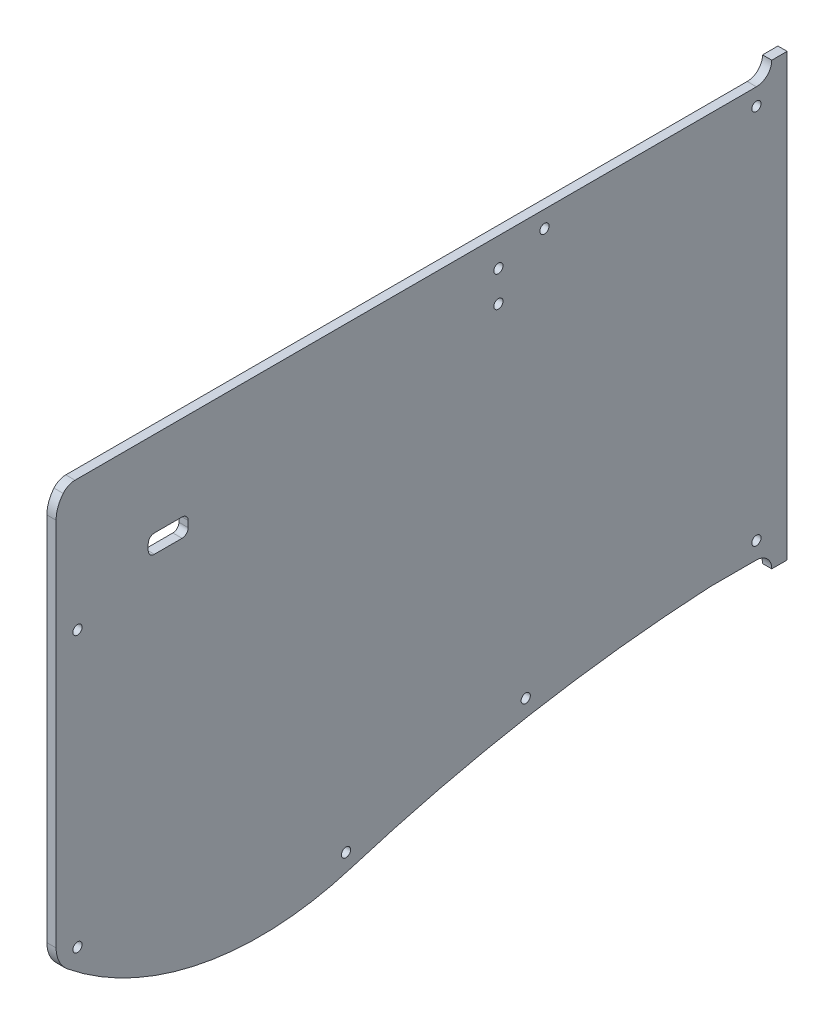
ISO-10303-21;
HEADER;
FILE_DESCRIPTION(('STEP AP214'),'2;1');
FILE_NAME('part.step','',(''),(''),'','','');
FILE_SCHEMA(('AUTOMOTIVE_DESIGN { 1 0 10303 214 1 1 1 1 }'));
ENDSEC;
DATA;
#1=APPLICATION_CONTEXT('core data for automotive mechanical design processes');
#2=APPLICATION_PROTOCOL_DEFINITION('international standard','automotive_design',2000,#1);
#3=PRODUCT_CONTEXT('',#1,'mechanical');
#4=PRODUCT('Part','Part','',(#3));
#5=PRODUCT_RELATED_PRODUCT_CATEGORY('part','',(#4));
#6=PRODUCT_DEFINITION_FORMATION('','',#4);
#7=PRODUCT_DEFINITION_CONTEXT('part definition',#1,'design');
#8=PRODUCT_DEFINITION('design','',#6,#7);
#9=PRODUCT_DEFINITION_SHAPE('','',#8);
#10=(LENGTH_UNIT() NAMED_UNIT(*) SI_UNIT(.MILLI.,.METRE.));
#11=(NAMED_UNIT(*) PLANE_ANGLE_UNIT() SI_UNIT($,.RADIAN.));
#12=(NAMED_UNIT(*) SI_UNIT($,.STERADIAN.) SOLID_ANGLE_UNIT());
#13=UNCERTAINTY_MEASURE_WITH_UNIT(LENGTH_MEASURE(1.E-05),#10,'distance_accuracy_value','');
#14=(GEOMETRIC_REPRESENTATION_CONTEXT(3) GLOBAL_UNCERTAINTY_ASSIGNED_CONTEXT((#13)) GLOBAL_UNIT_ASSIGNED_CONTEXT((#10,
#11,#12)) REPRESENTATION_CONTEXT('',''));
#15=CARTESIAN_POINT('',(0.,0.,0.));
#16=DIRECTION('',(0.,0.,1.));
#17=DIRECTION('',(1.,0.,0.));
#18=AXIS2_PLACEMENT_3D('',#15,#16,#17);
#19=CARTESIAN_POINT('',(-67.35,0.,0.));
#20=DIRECTION('',(1.,0.,0.));
#21=DIRECTION('',(0.,1.,0.));
#22=AXIS2_PLACEMENT_3D('',#19,#20,#21);
#23=PLANE('',#22);
#24=CARTESIAN_POINT('',(-67.35,32.6100000000027,-3.96799742352916));
#25=DIRECTION('',(-1.,0.,0.));
#26=DIRECTION('',(0.,-1.,0.));
#27=AXIS2_PLACEMENT_3D('',#24,#25,#26);
#28=CIRCLE('',#27,1.5);
#29=CARTESIAN_POINT('',(-67.35,31.1100000000027,-3.96799742352916));
#30=VERTEX_POINT('',#29);
#31=EDGE_CURVE('E678',#30,#30,#28,.T.);
#32=ORIENTED_EDGE('',*,*,#31,.T.);
#33=EDGE_LOOP('',(#32));
#34=FACE_BOUND('',#33,.T.);
#35=CARTESIAN_POINT('',(-67.35,-56.8674528394987,-3.96799742352917));
#36=DIRECTION('',(-1.,0.,0.));
#37=DIRECTION('',(0.,-1.,0.));
#38=AXIS2_PLACEMENT_3D('',#35,#36,#37);
#39=CIRCLE('',#38,1.5);
#40=CARTESIAN_POINT('',(-67.35,-58.3674528394987,-3.96799742352917));
#41=VERTEX_POINT('',#40);
#42=EDGE_CURVE('E684',#41,#41,#39,.T.);
#43=ORIENTED_EDGE('',*,*,#42,.T.);
#44=EDGE_LOOP('',(#43));
#45=FACE_BOUND('',#44,.T.);
#46=CARTESIAN_POINT('',(-67.35,-73.8406357420001,-91.3872993332656));
#47=DIRECTION('',(-1.,0.,0.));
#48=DIRECTION('',(0.,-1.,0.));
#49=AXIS2_PLACEMENT_3D('',#46,#47,#48);
#50=CIRCLE('',#49,1.5);
#51=CARTESIAN_POINT('',(-67.35,-75.3406357420001,-91.3872993332656));
#52=VERTEX_POINT('',#51);
#53=EDGE_CURVE('E690',#52,#52,#50,.T.);
#54=ORIENTED_EDGE('',*,*,#53,.T.);
#55=EDGE_LOOP('',(#54));
#56=FACE_BOUND('',#55,.T.);
#57=CARTESIAN_POINT('',(-67.35,-59.6455333368173,-149.8967439074));
#58=DIRECTION('',(-1.,0.,0.));
#59=DIRECTION('',(0.,-1.,0.));
#60=AXIS2_PLACEMENT_3D('',#57,#58,#59);
#61=CIRCLE('',#60,1.5);
#62=CARTESIAN_POINT('',(-67.35,-61.1455333368173,-149.8967439074));
#63=VERTEX_POINT('',#62);
#64=EDGE_CURVE('E696',#63,#63,#61,.T.);
#65=ORIENTED_EDGE('',*,*,#64,.T.);
#66=EDGE_LOOP('',(#65));
#67=FACE_BOUND('',#66,.T.);
#68=CARTESIAN_POINT('',(-67.35,-52.7209830876955,-225.));
#69=DIRECTION('',(-1.,0.,0.));
#70=DIRECTION('',(0.,-1.,0.));
#71=AXIS2_PLACEMENT_3D('',#68,#69,#70);
#72=CIRCLE('',#71,1.5);
#73=CARTESIAN_POINT('',(-67.35,-54.2209830876955,-225.));
#74=VERTEX_POINT('',#73);
#75=EDGE_CURVE('E702',#74,#74,#72,.T.);
#76=ORIENTED_EDGE('',*,*,#75,.T.);
#77=EDGE_LOOP('',(#76));
#78=FACE_BOUND('',#77,.T.);
#79=CARTESIAN_POINT('',(-67.35,69.7,-156.));
#80=DIRECTION('',(-1.,0.,0.));
#81=DIRECTION('',(0.,-1.,0.));
#82=AXIS2_PLACEMENT_3D('',#79,#80,#81);
#83=CIRCLE('',#82,1.5);
#84=CARTESIAN_POINT('',(-67.35,68.2,-156.));
#85=VERTEX_POINT('',#84);
#86=EDGE_CURVE('E708',#85,#85,#83,.T.);
#87=ORIENTED_EDGE('',*,*,#86,.T.);
#88=EDGE_LOOP('',(#87));
#89=FACE_BOUND('',#88,.T.);
#90=CARTESIAN_POINT('',(-67.35,69.7,-225.));
#91=DIRECTION('',(-1.,0.,0.));
#92=DIRECTION('',(0.,-1.,0.));
#93=AXIS2_PLACEMENT_3D('',#90,#91,#92);
#94=CIRCLE('',#93,1.5);
#95=CARTESIAN_POINT('',(-67.35,68.2,-225.));
#96=VERTEX_POINT('',#95);
#97=EDGE_CURVE('E214',#96,#96,#94,.T.);
#98=ORIENTED_EDGE('',*,*,#97,.T.);
#99=EDGE_LOOP('',(#98));
#100=FACE_BOUND('',#99,.T.);
#101=DIRECTION('',(0.,1.,0.));
#102=VECTOR('',#101,1.);
#103=CARTESIAN_POINT('',(-67.35,72.2,-235.));
#104=LINE('',#103,#102);
#105=CARTESIAN_POINT('',(-67.35,-63.225295910599,-235.));
#106=VERTEX_POINT('',#105);
#107=CARTESIAN_POINT('',(-67.35,80.2,-235.));
#108=VERTEX_POINT('',#107);
#109=EDGE_CURVE('E241',#106,#108,#104,.T.);
#110=ORIENTED_EDGE('',*,*,#109,.T.);
#111=DIRECTION('',(0.,0.,-1.));
#112=VECTOR('',#111,1.);
#113=CARTESIAN_POINT('',(-67.35,80.2,-230.));
#114=LINE('',#113,#112);
#115=CARTESIAN_POINT('',(-67.35,80.2,-230.));
#116=VERTEX_POINT('',#115);
#117=EDGE_CURVE('E212',#116,#108,#114,.T.);
#118=ORIENTED_EDGE('',*,*,#117,.F.);
#119=CARTESIAN_POINT('',(-67.35,80.2,-225.));
#120=DIRECTION('',(1.,0.,0.));
#121=DIRECTION('',(0.,1.,0.));
#122=AXIS2_PLACEMENT_3D('',#119,#120,#121);
#123=CIRCLE('',#122,5.);
#124=CARTESIAN_POINT('',(-67.35,75.2,-225.));
#125=VERTEX_POINT('',#124);
#126=EDGE_CURVE('E191',#116,#125,#123,.F.);
#127=ORIENTED_EDGE('',*,*,#126,.T.);
#128=DIRECTION('',(0.,0.,1.));
#129=VECTOR('',#128,1.);
#130=CARTESIAN_POINT('',(-67.35,75.2,3.));
#131=LINE('',#130,#129);
#132=CARTESIAN_POINT('',(-67.35,75.2,-3.1581254575403));
#133=VERTEX_POINT('',#132);
#134=EDGE_CURVE('E201',#125,#133,#131,.T.);
#135=ORIENTED_EDGE('',*,*,#134,.T.);
#136=CARTESIAN_POINT('',(-67.35,70.2,-3.1581254575403));
#137=DIRECTION('',(1.,0.,0.));
#138=DIRECTION('',(0.,1.,0.));
#139=AXIS2_PLACEMENT_3D('',#136,#137,#138);
#140=CIRCLE('',#139,5.);
#141=CARTESIAN_POINT('',(-67.35,73.4,0.683749084919405));
#142=VERTEX_POINT('',#141);
#143=EDGE_CURVE('E267',#142,#133,#140,.F.);
#144=ORIENTED_EDGE('',*,*,#143,.F.);
#145=CARTESIAN_POINT('',(-67.35,67.,-7.));
#146=DIRECTION('',(1.,0.,0.));
#147=DIRECTION('',(0.,1.,0.));
#148=AXIS2_PLACEMENT_3D('',#145,#146,#147);
#149=CIRCLE('',#148,10.);
#150=CARTESIAN_POINT('',(-67.35,67.,3.));
#151=VERTEX_POINT('',#150);
#152=EDGE_CURVE('E269',#151,#142,#149,.F.);
#153=ORIENTED_EDGE('',*,*,#152,.F.);
#154=DIRECTION('',(0.,-1.,0.));
#155=VECTOR('',#154,1.);
#156=CARTESIAN_POINT('',(-67.35,0.,3.));
#157=LINE('',#156,#155);
#158=CARTESIAN_POINT('',(-67.35,-53.596869973958,3.));
#159=VERTEX_POINT('',#158);
#160=EDGE_CURVE('E207',#151,#159,#157,.T.);
#161=ORIENTED_EDGE('',*,*,#160,.T.);
#162=CARTESIAN_POINT('',(-67.35,-53.596869973958,-7.));
#163=DIRECTION('',(1.,0.,0.));
#164=DIRECTION('',(0.,1.,0.));
#165=AXIS2_PLACEMENT_3D('',#162,#163,#164);
#166=CIRCLE('',#165,10.);
#167=CARTESIAN_POINT('',(-67.35,-61.3801825213862,-0.721461492588713));
#168=VERTEX_POINT('',#167);
#169=EDGE_CURVE('E272',#168,#159,#166,.F.);
#170=ORIENTED_EDGE('',*,*,#169,.F.);
#171=CARTESIAN_POINT('',(-67.35,16.452942952896,-63.5068465667016));
#172=DIRECTION('',(1.,0.,0.));
#173=DIRECTION('',(0.,1.,0.));
#174=AXIS2_PLACEMENT_3D('',#171,#172,#173);
#175=CIRCLE('',#174,100.);
#176=CARTESIAN_POINT('',(-67.35,-79.0958175708036,-93.0099711874042));
#177=VERTEX_POINT('',#176);
#178=EDGE_CURVE('E274',#177,#168,#175,.F.);
#179=ORIENTED_EDGE('',*,*,#178,.F.);
#180=CARTESIAN_POINT('',(-67.3500000000001,-542.024846852173,-235.951153957029));
#181=DIRECTION('',(1.,0.,0.));
#182=DIRECTION('',(0.,1.,0.));
#183=AXIS2_PLACEMENT_3D('',#180,#181,#182);
#184=CIRCLE('',#183,484.495064869571);
#185=CARTESIAN_POINT('',(-67.35,-58.225295910599,-210.));
#186=VERTEX_POINT('',#185);
#187=EDGE_CURVE('E213',#177,#186,#184,.F.);
#188=ORIENTED_EDGE('',*,*,#187,.T.);
#189=DIRECTION('',(0.,0.,-1.));
#190=VECTOR('',#189,1.);
#191=CARTESIAN_POINT('',(-67.35,-58.225295910599,-225.));
#192=LINE('',#191,#190);
#193=CARTESIAN_POINT('',(-67.35,-58.225295910599,-225.));
#194=VERTEX_POINT('',#193);
#195=EDGE_CURVE('E206',#186,#194,#192,.T.);
#196=ORIENTED_EDGE('',*,*,#195,.T.);
#197=CARTESIAN_POINT('',(-67.35,-63.225295910599,-225.));
#198=DIRECTION('',(1.,0.,0.));
#199=DIRECTION('',(0.,1.,0.));
#200=AXIS2_PLACEMENT_3D('',#197,#198,#199);
#201=CIRCLE('',#200,5.);
#202=CARTESIAN_POINT('',(-67.35,-63.225295910599,-230.));
#203=VERTEX_POINT('',#202);
#204=EDGE_CURVE('E277',#194,#203,#201,.F.);
#205=ORIENTED_EDGE('',*,*,#204,.T.);
#206=DIRECTION('',(0.,0.,1.));
#207=VECTOR('',#206,1.);
#208=CARTESIAN_POINT('',(-67.35,-63.225295910599,-230.));
#209=LINE('',#208,#207);
#210=EDGE_CURVE('E264',#106,#203,#209,.T.);
#211=ORIENTED_EDGE('',*,*,#210,.F.);
#212=EDGE_LOOP('',(#110,#118,#127,#135,#144,#153,#161,#170,#179,#188,#196,#205,#211));
#213=FACE_BOUND('',#212,.T.);
#214=CARTESIAN_POINT('',(-67.35,56.,-141.));
#215=DIRECTION('',(-1.,0.,0.));
#216=DIRECTION('',(0.,-1.,0.));
#217=AXIS2_PLACEMENT_3D('',#214,#215,#216);
#218=CIRCLE('',#217,1.5);
#219=CARTESIAN_POINT('',(-67.35,54.5,-141.));
#220=VERTEX_POINT('',#219);
#221=EDGE_CURVE('E252',#220,#220,#218,.T.);
#222=ORIENTED_EDGE('',*,*,#221,.T.);
#223=EDGE_LOOP('',(#222));
#224=FACE_BOUND('',#223,.T.);
#225=CARTESIAN_POINT('',(-67.35,66.,-141.));
#226=DIRECTION('',(-1.,0.,0.));
#227=DIRECTION('',(0.,-1.,0.));
#228=AXIS2_PLACEMENT_3D('',#225,#226,#227);
#229=CIRCLE('',#228,1.5);
#230=CARTESIAN_POINT('',(-67.35,64.5,-141.));
#231=VERTEX_POINT('',#230);
#232=EDGE_CURVE('E255',#231,#231,#229,.T.);
#233=ORIENTED_EDGE('',*,*,#232,.T.);
#234=EDGE_LOOP('',(#233));
#235=FACE_BOUND('',#234,.T.);
#236=DIRECTION('',(0.,0.,1.));
#237=VECTOR('',#236,1.);
#238=CARTESIAN_POINT('',(-67.35,41.4,-358.498117719212));
#239=LINE('',#238,#237);
#240=CARTESIAN_POINT('',(-67.35,41.4,-38.));
#241=VERTEX_POINT('',#240);
#242=CARTESIAN_POINT('',(-67.35,41.4,-29.));
#243=VERTEX_POINT('',#242);
#244=EDGE_CURVE('E645',#241,#243,#239,.T.);
#245=ORIENTED_EDGE('',*,*,#244,.T.);
#246=CARTESIAN_POINT('',(-67.35,43.4,-29.));
#247=DIRECTION('',(-1.,0.,0.));
#248=DIRECTION('',(0.,-1.,0.));
#249=AXIS2_PLACEMENT_3D('',#246,#247,#248);
#250=CIRCLE('',#249,2.);
#251=CARTESIAN_POINT('',(-67.35,43.4,-27.));
#252=VERTEX_POINT('',#251);
#253=EDGE_CURVE('E235',#243,#252,#250,.T.);
#254=ORIENTED_EDGE('',*,*,#253,.T.);
#255=DIRECTION('',(0.,1.,0.));
#256=VECTOR('',#255,1.);
#257=CARTESIAN_POINT('',(-67.35,0.,-27.));
#258=LINE('',#257,#256);
#259=CARTESIAN_POINT('',(-67.35,45.4,-27.));
#260=VERTEX_POINT('',#259);
#261=EDGE_CURVE('E615',#252,#260,#258,.T.);
#262=ORIENTED_EDGE('',*,*,#261,.T.);
#263=CARTESIAN_POINT('',(-67.35,45.4,-29.));
#264=DIRECTION('',(-1.,0.,0.));
#265=DIRECTION('',(0.,-1.,0.));
#266=AXIS2_PLACEMENT_3D('',#263,#264,#265);
#267=CIRCLE('',#266,2.);
#268=CARTESIAN_POINT('',(-67.35,47.4,-29.));
#269=VERTEX_POINT('',#268);
#270=EDGE_CURVE('E657',#260,#269,#267,.T.);
#271=ORIENTED_EDGE('',*,*,#270,.T.);
#272=DIRECTION('',(0.,0.,-1.));
#273=VECTOR('',#272,1.);
#274=CARTESIAN_POINT('',(-67.35,47.4000000000002,-358.498117719212));
#275=LINE('',#274,#273);
#276=CARTESIAN_POINT('',(-67.35,47.4,-38.));
#277=VERTEX_POINT('',#276);
#278=EDGE_CURVE('E654',#269,#277,#275,.T.);
#279=ORIENTED_EDGE('',*,*,#278,.T.);
#280=CARTESIAN_POINT('',(-67.35,45.4,-38.));
#281=DIRECTION('',(-1.,0.,0.));
#282=DIRECTION('',(0.,-1.,0.));
#283=AXIS2_PLACEMENT_3D('',#280,#281,#282);
#284=CIRCLE('',#283,2.00000000000001);
#285=CARTESIAN_POINT('',(-67.35,45.4,-40.));
#286=VERTEX_POINT('',#285);
#287=EDGE_CURVE('E652',#277,#286,#284,.T.);
#288=ORIENTED_EDGE('',*,*,#287,.T.);
#289=DIRECTION('',(0.,-1.,0.));
#290=VECTOR('',#289,1.);
#291=CARTESIAN_POINT('',(-67.35,1.11130955899717E-12,-39.9999999999998));
#292=LINE('',#291,#290);
#293=CARTESIAN_POINT('',(-67.35,43.4,-40.));
#294=VERTEX_POINT('',#293);
#295=EDGE_CURVE('E599',#286,#294,#292,.T.);
#296=ORIENTED_EDGE('',*,*,#295,.T.);
#297=CARTESIAN_POINT('',(-67.35,43.4,-38.));
#298=DIRECTION('',(-1.,0.,0.));
#299=DIRECTION('',(0.,-1.,0.));
#300=AXIS2_PLACEMENT_3D('',#297,#298,#299);
#301=CIRCLE('',#300,2.);
#302=EDGE_CURVE('E648',#294,#241,#301,.T.);
#303=ORIENTED_EDGE('',*,*,#302,.T.);
#304=EDGE_LOOP('',(#245,#254,#262,#271,#279,#288,#296,#303));
#305=FACE_BOUND('',#304,.T.);
#306=ADVANCED_FACE('F45',(#34,#45,#56,#67,#78,#89,#100,#213,#224,#235,#305),#23,.T.);
#307=CARTESIAN_POINT('',(-62.,41.4,-29.));
#308=DIRECTION('',(0.,-1.,0.));
#309=DIRECTION('',(0.,0.,-1.));
#310=AXIS2_PLACEMENT_3D('',#307,#308,#309);
#311=PLANE('',#310);
#312=DIRECTION('',(-1.,0.,0.));
#313=VECTOR('',#312,1.);
#314=CARTESIAN_POINT('',(-62.,41.4,-38.));
#315=LINE('',#314,#313);
#316=CARTESIAN_POINT('',(-70.35,41.4,-38.));
#317=VERTEX_POINT('',#316);
#318=EDGE_CURVE('E608',#241,#317,#315,.T.);
#319=ORIENTED_EDGE('',*,*,#318,.T.);
#320=DIRECTION('',(0.,0.,1.));
#321=VECTOR('',#320,1.);
#322=CARTESIAN_POINT('',(-70.35,41.4,-29.));
#323=LINE('',#322,#321);
#324=CARTESIAN_POINT('',(-70.35,41.4,-29.));
#325=VERTEX_POINT('',#324);
#326=EDGE_CURVE('E619',#317,#325,#323,.T.);
#327=ORIENTED_EDGE('',*,*,#326,.T.);
#328=DIRECTION('',(-1.,0.,0.));
#329=VECTOR('',#328,1.);
#330=CARTESIAN_POINT('',(-62.,41.4,-29.));
#331=LINE('',#330,#329);
#332=EDGE_CURVE('E613',#243,#325,#331,.T.);
#333=ORIENTED_EDGE('',*,*,#332,.F.);
#334=ORIENTED_EDGE('',*,*,#244,.F.);
#335=EDGE_LOOP('',(#319,#327,#333,#334));
#336=FACE_BOUND('',#335,.T.);
#337=ADVANCED_FACE('F341',(#336),#311,.F.);
#338=CARTESIAN_POINT('',(-62.,43.4,-38.));
#339=DIRECTION('',(-1.,0.,0.));
#340=DIRECTION('',(0.,0.,1.));
#341=AXIS2_PLACEMENT_3D('',#338,#339,#340);
#342=CYLINDRICAL_SURFACE('',#341,2.);
#343=DIRECTION('',(-1.,0.,0.));
#344=VECTOR('',#343,1.);
#345=CARTESIAN_POINT('',(-62.,43.4,-40.));
#346=LINE('',#345,#344);
#347=CARTESIAN_POINT('',(-70.35,43.4,-40.));
#348=VERTEX_POINT('',#347);
#349=EDGE_CURVE('E603',#294,#348,#346,.T.);
#350=ORIENTED_EDGE('',*,*,#349,.T.);
#351=CARTESIAN_POINT('',(-70.35,43.4,-38.));
#352=DIRECTION('',(1.,0.,0.));
#353=DIRECTION('',(0.,1.,0.));
#354=AXIS2_PLACEMENT_3D('',#351,#352,#353);
#355=CIRCLE('',#354,2.);
#356=EDGE_CURVE('E622',#348,#317,#355,.F.);
#357=ORIENTED_EDGE('',*,*,#356,.T.);
#358=ORIENTED_EDGE('',*,*,#318,.F.);
#359=ORIENTED_EDGE('',*,*,#302,.F.);
#360=EDGE_LOOP('',(#350,#357,#358,#359));
#361=FACE_BOUND('',#360,.T.);
#362=ADVANCED_FACE('F343',(#361),#342,.F.);
#363=CARTESIAN_POINT('',(-62.,43.4,-40.));
#364=DIRECTION('',(0.,0.,-1.));
#365=DIRECTION('',(0.,1.,0.));
#366=AXIS2_PLACEMENT_3D('',#363,#364,#365);
#367=PLANE('',#366);
#368=DIRECTION('',(-1.,0.,0.));
#369=VECTOR('',#368,1.);
#370=CARTESIAN_POINT('',(-62.,45.4,-40.));
#371=LINE('',#370,#369);
#372=CARTESIAN_POINT('',(-70.35,45.4,-40.));
#373=VERTEX_POINT('',#372);
#374=EDGE_CURVE('E594',#286,#373,#371,.T.);
#375=ORIENTED_EDGE('',*,*,#374,.T.);
#376=DIRECTION('',(0.,-1.,0.));
#377=VECTOR('',#376,1.);
#378=CARTESIAN_POINT('',(-70.35,43.4,-40.));
#379=LINE('',#378,#377);
#380=EDGE_CURVE('E596',#373,#348,#379,.T.);
#381=ORIENTED_EDGE('',*,*,#380,.T.);
#382=ORIENTED_EDGE('',*,*,#349,.F.);
#383=ORIENTED_EDGE('',*,*,#295,.F.);
#384=EDGE_LOOP('',(#375,#381,#382,#383));
#385=FACE_BOUND('',#384,.T.);
#386=ADVANCED_FACE('F349',(#385),#367,.F.);
#387=CARTESIAN_POINT('',(-62.,45.4,-38.));
#388=DIRECTION('',(-1.,0.,0.));
#389=DIRECTION('',(0.,0.,1.));
#390=AXIS2_PLACEMENT_3D('',#387,#388,#389);
#391=CYLINDRICAL_SURFACE('',#390,2.00000000000001);
#392=DIRECTION('',(-1.,0.,0.));
#393=VECTOR('',#392,1.);
#394=CARTESIAN_POINT('',(-62.,47.4,-38.));
#395=LINE('',#394,#393);
#396=CARTESIAN_POINT('',(-70.35,47.4,-38.));
#397=VERTEX_POINT('',#396);
#398=EDGE_CURVE('E602',#277,#397,#395,.T.);
#399=ORIENTED_EDGE('',*,*,#398,.T.);
#400=CARTESIAN_POINT('',(-70.35,45.4,-38.));
#401=DIRECTION('',(1.,0.,0.));
#402=DIRECTION('',(0.,1.,0.));
#403=AXIS2_PLACEMENT_3D('',#400,#401,#402);
#404=CIRCLE('',#403,2.00000000000001);
#405=EDGE_CURVE('E626',#397,#373,#404,.F.);
#406=ORIENTED_EDGE('',*,*,#405,.T.);
#407=ORIENTED_EDGE('',*,*,#374,.F.);
#408=ORIENTED_EDGE('',*,*,#287,.F.);
#409=EDGE_LOOP('',(#399,#406,#407,#408));
#410=FACE_BOUND('',#409,.T.);
#411=ADVANCED_FACE('F583',(#410),#391,.F.);
#412=CARTESIAN_POINT('',(-62.,47.4,-29.));
#413=DIRECTION('',(0.,1.,0.));
#414=DIRECTION('',(0.,0.,1.));
#415=AXIS2_PLACEMENT_3D('',#412,#413,#414);
#416=PLANE('',#415);
#417=DIRECTION('',(-1.,0.,0.));
#418=VECTOR('',#417,1.);
#419=CARTESIAN_POINT('',(-62.,47.4,-29.));
#420=LINE('',#419,#418);
#421=CARTESIAN_POINT('',(-70.35,47.4,-29.));
#422=VERTEX_POINT('',#421);
#423=EDGE_CURVE('E606',#269,#422,#420,.T.);
#424=ORIENTED_EDGE('',*,*,#423,.T.);
#425=DIRECTION('',(0.,0.,-1.));
#426=VECTOR('',#425,1.);
#427=CARTESIAN_POINT('',(-70.35,47.4,-29.));
#428=LINE('',#427,#426);
#429=EDGE_CURVE('E628',#422,#397,#428,.T.);
#430=ORIENTED_EDGE('',*,*,#429,.T.);
#431=ORIENTED_EDGE('',*,*,#398,.F.);
#432=ORIENTED_EDGE('',*,*,#278,.F.);
#433=EDGE_LOOP('',(#424,#430,#431,#432));
#434=FACE_BOUND('',#433,.T.);
#435=ADVANCED_FACE('F579',(#434),#416,.F.);
#436=CARTESIAN_POINT('',(-62.,45.4,-29.));
#437=DIRECTION('',(-1.,0.,0.));
#438=DIRECTION('',(0.,0.,1.));
#439=AXIS2_PLACEMENT_3D('',#436,#437,#438);
#440=CYLINDRICAL_SURFACE('',#439,2.);
#441=DIRECTION('',(-1.,0.,0.));
#442=VECTOR('',#441,1.);
#443=CARTESIAN_POINT('',(-62.,45.4,-27.));
#444=LINE('',#443,#442);
#445=CARTESIAN_POINT('',(-70.35,45.4,-27.));
#446=VERTEX_POINT('',#445);
#447=EDGE_CURVE('E664',#260,#446,#444,.T.);
#448=ORIENTED_EDGE('',*,*,#447,.T.);
#449=CARTESIAN_POINT('',(-70.35,45.4,-29.));
#450=DIRECTION('',(1.,0.,0.));
#451=DIRECTION('',(0.,1.,0.));
#452=AXIS2_PLACEMENT_3D('',#449,#450,#451);
#453=CIRCLE('',#452,2.);
#454=EDGE_CURVE('E631',#446,#422,#453,.F.);
#455=ORIENTED_EDGE('',*,*,#454,.T.);
#456=ORIENTED_EDGE('',*,*,#423,.F.);
#457=ORIENTED_EDGE('',*,*,#270,.F.);
#458=EDGE_LOOP('',(#448,#455,#456,#457));
#459=FACE_BOUND('',#458,.T.);
#460=ADVANCED_FACE('F379',(#459),#440,.F.);
#461=CARTESIAN_POINT('',(0.,-58.225295910599,-225.));
#462=DIRECTION('',(0.,1.,0.));
#463=DIRECTION('',(-1.,0.,0.));
#464=AXIS2_PLACEMENT_3D('',#461,#462,#463);
#465=PLANE('',#464);
#466=ORIENTED_EDGE('',*,*,#195,.F.);
#467=DIRECTION('',(1.,0.,0.));
#468=VECTOR('',#467,1.);
#469=CARTESIAN_POINT('',(-72.,-58.225295910599,-210.));
#470=LINE('',#469,#468);
#471=CARTESIAN_POINT('',(-70.35,-58.225295910599,-210.));
#472=VERTEX_POINT('',#471);
#473=EDGE_CURVE('E236',#472,#186,#470,.T.);
#474=ORIENTED_EDGE('',*,*,#473,.F.);
#475=DIRECTION('',(0.,0.,-1.));
#476=VECTOR('',#475,1.);
#477=CARTESIAN_POINT('',(-70.35,-58.225295910599,-225.));
#478=LINE('',#477,#476);
#479=CARTESIAN_POINT('',(-70.35,-58.225295910599,-225.));
#480=VERTEX_POINT('',#479);
#481=EDGE_CURVE('E309',#472,#480,#478,.T.);
#482=ORIENTED_EDGE('',*,*,#481,.T.);
#483=DIRECTION('',(1.,0.,0.));
#484=VECTOR('',#483,1.);
#485=CARTESIAN_POINT('',(10.,-58.225295910599,-225.));
#486=LINE('',#485,#484);
#487=EDGE_CURVE('E196',#480,#194,#486,.T.);
#488=ORIENTED_EDGE('',*,*,#487,.T.);
#489=EDGE_LOOP('',(#466,#474,#482,#488));
#490=FACE_BOUND('',#489,.T.);
#491=ADVANCED_FACE('F376',(#490),#465,.F.);
#492=CARTESIAN_POINT('',(0.,0.,3.));
#493=DIRECTION('',(0.,0.,-1.));
#494=DIRECTION('',(-1.,0.,0.));
#495=AXIS2_PLACEMENT_3D('',#492,#493,#494);
#496=PLANE('',#495);
#497=ORIENTED_EDGE('',*,*,#160,.F.);
#498=DIRECTION('',(-1.,0.,0.));
#499=VECTOR('',#498,1.);
#500=CARTESIAN_POINT('',(0.,67.,3.));
#501=LINE('',#500,#499);
#502=CARTESIAN_POINT('',(-70.35,67.,3.));
#503=VERTEX_POINT('',#502);
#504=EDGE_CURVE('E228',#151,#503,#501,.T.);
#505=ORIENTED_EDGE('',*,*,#504,.T.);
#506=DIRECTION('',(0.,-1.,0.));
#507=VECTOR('',#506,1.);
#508=CARTESIAN_POINT('',(-70.35,0.,3.));
#509=LINE('',#508,#507);
#510=CARTESIAN_POINT('',(-70.35,-53.596869973958,3.));
#511=VERTEX_POINT('',#510);
#512=EDGE_CURVE('E290',#503,#511,#509,.T.);
#513=ORIENTED_EDGE('',*,*,#512,.T.);
#514=DIRECTION('',(-1.,0.,0.));
#515=VECTOR('',#514,1.);
#516=CARTESIAN_POINT('',(9.99999999999998,-53.596869973958,3.));
#517=LINE('',#516,#515);
#518=EDGE_CURVE('E232',#511,#159,#517,.F.);
#519=ORIENTED_EDGE('',*,*,#518,.T.);
#520=EDGE_LOOP('',(#497,#505,#513,#519));
#521=FACE_BOUND('',#520,.T.);
#522=ADVANCED_FACE('F288',(#521),#496,.F.);
#523=CARTESIAN_POINT('',(0.,75.2,3.));
#524=DIRECTION('',(0.,-1.,0.));
#525=DIRECTION('',(0.,0.,-1.));
#526=AXIS2_PLACEMENT_3D('',#523,#524,#525);
#527=PLANE('',#526);
#528=ORIENTED_EDGE('',*,*,#134,.F.);
#529=DIRECTION('',(-1.,0.,0.));
#530=VECTOR('',#529,1.);
#531=CARTESIAN_POINT('',(0.,75.2,-225.));
#532=LINE('',#531,#530);
#533=CARTESIAN_POINT('',(-70.35,75.2,-225.));
#534=VERTEX_POINT('',#533);
#535=EDGE_CURVE('E186',#125,#534,#532,.T.);
#536=ORIENTED_EDGE('',*,*,#535,.T.);
#537=DIRECTION('',(0.,0.,-1.));
#538=VECTOR('',#537,1.);
#539=CARTESIAN_POINT('',(-70.35,75.2,3.));
#540=LINE('',#539,#538);
#541=CARTESIAN_POINT('',(-70.35,75.2,-3.1581254575403));
#542=VERTEX_POINT('',#541);
#543=EDGE_CURVE('E317',#542,#534,#540,.T.);
#544=ORIENTED_EDGE('',*,*,#543,.F.);
#545=DIRECTION('',(1.,0.,0.));
#546=VECTOR('',#545,1.);
#547=CARTESIAN_POINT('',(9.99999999999998,75.2,-3.1581254575403));
#548=LINE('',#547,#546);
#549=EDGE_CURVE('E204',#542,#133,#548,.T.);
#550=ORIENTED_EDGE('',*,*,#549,.T.);
#551=EDGE_LOOP('',(#528,#536,#544,#550));
#552=FACE_BOUND('',#551,.T.);
#553=ADVANCED_FACE('F202',(#552),#527,.F.);
#554=CARTESIAN_POINT('',(-70.35,0.,3.));
#555=DIRECTION('',(1.,0.,0.));
#556=DIRECTION('',(0.,1.,0.));
#557=AXIS2_PLACEMENT_3D('',#554,#555,#556);
#558=PLANE('',#557);
#559=CARTESIAN_POINT('',(-70.35,32.6100000000027,-3.96799742352916));
#560=DIRECTION('',(-1.,0.,0.));
#561=DIRECTION('',(0.,-1.,0.));
#562=AXIS2_PLACEMENT_3D('',#559,#560,#561);
#563=CIRCLE('',#562,1.5);
#564=CARTESIAN_POINT('',(-70.35,31.1100000000027,-3.96799742352916));
#565=VERTEX_POINT('',#564);
#566=EDGE_CURVE('E681',#565,#565,#563,.T.);
#567=ORIENTED_EDGE('',*,*,#566,.F.);
#568=EDGE_LOOP('',(#567));
#569=FACE_BOUND('',#568,.T.);
#570=CARTESIAN_POINT('',(-70.35,-56.8674528394987,-3.96799742352917));
#571=DIRECTION('',(-1.,0.,0.));
#572=DIRECTION('',(0.,-1.,0.));
#573=AXIS2_PLACEMENT_3D('',#570,#571,#572);
#574=CIRCLE('',#573,1.5);
#575=CARTESIAN_POINT('',(-70.35,-58.3674528394987,-3.96799742352917));
#576=VERTEX_POINT('',#575);
#577=EDGE_CURVE('E687',#576,#576,#574,.T.);
#578=ORIENTED_EDGE('',*,*,#577,.F.);
#579=EDGE_LOOP('',(#578));
#580=FACE_BOUND('',#579,.T.);
#581=CARTESIAN_POINT('',(-70.35,-73.8406357420001,-91.3872993332656));
#582=DIRECTION('',(-1.,0.,0.));
#583=DIRECTION('',(0.,-1.,0.));
#584=AXIS2_PLACEMENT_3D('',#581,#582,#583);
#585=CIRCLE('',#584,1.5);
#586=CARTESIAN_POINT('',(-70.35,-75.3406357420001,-91.3872993332656));
#587=VERTEX_POINT('',#586);
#588=EDGE_CURVE('E693',#587,#587,#585,.T.);
#589=ORIENTED_EDGE('',*,*,#588,.F.);
#590=EDGE_LOOP('',(#589));
#591=FACE_BOUND('',#590,.T.);
#592=CARTESIAN_POINT('',(-70.35,-59.6455333368173,-149.8967439074));
#593=DIRECTION('',(-1.,0.,0.));
#594=DIRECTION('',(0.,-1.,0.));
#595=AXIS2_PLACEMENT_3D('',#592,#593,#594);
#596=CIRCLE('',#595,1.5);
#597=CARTESIAN_POINT('',(-70.35,-61.1455333368173,-149.8967439074));
#598=VERTEX_POINT('',#597);
#599=EDGE_CURVE('E699',#598,#598,#596,.T.);
#600=ORIENTED_EDGE('',*,*,#599,.F.);
#601=EDGE_LOOP('',(#600));
#602=FACE_BOUND('',#601,.T.);
#603=CARTESIAN_POINT('',(-70.35,-52.7209830876955,-225.));
#604=DIRECTION('',(-1.,0.,0.));
#605=DIRECTION('',(0.,-1.,0.));
#606=AXIS2_PLACEMENT_3D('',#603,#604,#605);
#607=CIRCLE('',#606,1.5);
#608=CARTESIAN_POINT('',(-70.35,-54.2209830876955,-225.));
#609=VERTEX_POINT('',#608);
#610=EDGE_CURVE('E705',#609,#609,#607,.T.);
#611=ORIENTED_EDGE('',*,*,#610,.F.);
#612=EDGE_LOOP('',(#611));
#613=FACE_BOUND('',#612,.T.);
#614=CARTESIAN_POINT('',(-70.35,69.7,-156.));
#615=DIRECTION('',(-1.,0.,0.));
#616=DIRECTION('',(0.,-1.,0.));
#617=AXIS2_PLACEMENT_3D('',#614,#615,#616);
#618=CIRCLE('',#617,1.5);
#619=CARTESIAN_POINT('',(-70.35,68.2,-156.));
#620=VERTEX_POINT('',#619);
#621=EDGE_CURVE('E676',#620,#620,#618,.T.);
#622=ORIENTED_EDGE('',*,*,#621,.F.);
#623=EDGE_LOOP('',(#622));
#624=FACE_BOUND('',#623,.T.);
#625=CARTESIAN_POINT('',(-70.35,69.7,-225.));
#626=DIRECTION('',(-1.,0.,0.));
#627=DIRECTION('',(0.,-1.,0.));
#628=AXIS2_PLACEMENT_3D('',#625,#626,#627);
#629=CIRCLE('',#628,1.5);
#630=CARTESIAN_POINT('',(-70.35,68.2,-225.));
#631=VERTEX_POINT('',#630);
#632=EDGE_CURVE('E219',#631,#631,#629,.T.);
#633=ORIENTED_EDGE('',*,*,#632,.F.);
#634=EDGE_LOOP('',(#633));
#635=FACE_BOUND('',#634,.T.);
#636=CARTESIAN_POINT('',(-70.35,56.,-141.));
#637=DIRECTION('',(-1.,0.,0.));
#638=DIRECTION('',(0.,-1.,0.));
#639=AXIS2_PLACEMENT_3D('',#636,#637,#638);
#640=CIRCLE('',#639,1.5);
#641=CARTESIAN_POINT('',(-70.35,54.5,-141.));
#642=VERTEX_POINT('',#641);
#643=EDGE_CURVE('E55',#642,#642,#640,.T.);
#644=ORIENTED_EDGE('',*,*,#643,.F.);
#645=EDGE_LOOP('',(#644));
#646=FACE_BOUND('',#645,.T.);
#647=CARTESIAN_POINT('',(-70.35,66.,-141.));
#648=DIRECTION('',(-1.,0.,0.));
#649=DIRECTION('',(0.,-1.,0.));
#650=AXIS2_PLACEMENT_3D('',#647,#648,#649);
#651=CIRCLE('',#650,1.5);
#652=CARTESIAN_POINT('',(-70.35,64.5,-141.));
#653=VERTEX_POINT('',#652);
#654=EDGE_CURVE('E11',#653,#653,#651,.T.);
#655=ORIENTED_EDGE('',*,*,#654,.F.);
#656=EDGE_LOOP('',(#655));
#657=FACE_BOUND('',#656,.T.);
#658=CARTESIAN_POINT('',(-70.35,67.,-7.));
#659=DIRECTION('',(1.,0.,0.));
#660=DIRECTION('',(0.,1.,0.));
#661=AXIS2_PLACEMENT_3D('',#658,#659,#660);
#662=CIRCLE('',#661,10.);
#663=CARTESIAN_POINT('',(-70.35,73.4,0.683749084919405));
#664=VERTEX_POINT('',#663);
#665=EDGE_CURVE('E311',#503,#664,#662,.F.);
#666=ORIENTED_EDGE('',*,*,#665,.T.);
#667=CARTESIAN_POINT('',(-70.35,70.2,-3.1581254575403));
#668=DIRECTION('',(1.,0.,0.));
#669=DIRECTION('',(0.,1.,0.));
#670=AXIS2_PLACEMENT_3D('',#667,#668,#669);
#671=CIRCLE('',#670,5.);
#672=EDGE_CURVE('E224',#664,#542,#671,.F.);
#673=ORIENTED_EDGE('',*,*,#672,.T.);
#674=ORIENTED_EDGE('',*,*,#543,.T.);
#675=CARTESIAN_POINT('',(-70.35,80.2,-225.));
#676=DIRECTION('',(1.,0.,0.));
#677=DIRECTION('',(0.,1.,0.));
#678=AXIS2_PLACEMENT_3D('',#675,#676,#677);
#679=CIRCLE('',#678,5.);
#680=CARTESIAN_POINT('',(-70.35,80.2,-230.));
#681=VERTEX_POINT('',#680);
#682=EDGE_CURVE('E192',#534,#681,#679,.T.);
#683=ORIENTED_EDGE('',*,*,#682,.T.);
#684=DIRECTION('',(0.,0.,-1.));
#685=VECTOR('',#684,1.);
#686=CARTESIAN_POINT('',(-70.35,80.2,-230.));
#687=LINE('',#686,#685);
#688=CARTESIAN_POINT('',(-70.35,80.2,-235.));
#689=VERTEX_POINT('',#688);
#690=EDGE_CURVE('E245',#681,#689,#687,.T.);
#691=ORIENTED_EDGE('',*,*,#690,.T.);
#692=DIRECTION('',(0.,-1.,0.));
#693=VECTOR('',#692,1.);
#694=CARTESIAN_POINT('',(-70.35,0.,-235.));
#695=LINE('',#694,#693);
#696=CARTESIAN_POINT('',(-70.35,-63.225295910599,-235.));
#697=VERTEX_POINT('',#696);
#698=EDGE_CURVE('E319',#689,#697,#695,.T.);
#699=ORIENTED_EDGE('',*,*,#698,.T.);
#700=DIRECTION('',(0.,0.,-1.));
#701=VECTOR('',#700,1.);
#702=CARTESIAN_POINT('',(-70.35,-63.225295910599,-230.));
#703=LINE('',#702,#701);
#704=CARTESIAN_POINT('',(-70.35,-63.225295910599,-230.));
#705=VERTEX_POINT('',#704);
#706=EDGE_CURVE('E251',#705,#697,#703,.T.);
#707=ORIENTED_EDGE('',*,*,#706,.F.);
#708=CARTESIAN_POINT('',(-70.35,-63.225295910599,-225.));
#709=DIRECTION('',(1.,0.,0.));
#710=DIRECTION('',(0.,1.,0.));
#711=AXIS2_PLACEMENT_3D('',#708,#709,#710);
#712=CIRCLE('',#711,5.);
#713=EDGE_CURVE('E197',#705,#480,#712,.T.);
#714=ORIENTED_EDGE('',*,*,#713,.T.);
#715=ORIENTED_EDGE('',*,*,#481,.F.);
#716=CARTESIAN_POINT('',(-70.35,-542.024846852173,-235.951153957029));
#717=DIRECTION('',(1.,0.,0.));
#718=DIRECTION('',(0.,1.,0.));
#719=AXIS2_PLACEMENT_3D('',#716,#717,#718);
#720=CIRCLE('',#719,484.495064869571);
#721=CARTESIAN_POINT('',(-70.35,-79.0958175708036,-93.0099711874042));
#722=VERTEX_POINT('',#721);
#723=EDGE_CURVE('E306',#722,#472,#720,.F.);
#724=ORIENTED_EDGE('',*,*,#723,.F.);
#725=CARTESIAN_POINT('',(-70.35,16.452942952896,-63.5068465667016));
#726=DIRECTION('',(1.,0.,0.));
#727=DIRECTION('',(0.,1.,0.));
#728=AXIS2_PLACEMENT_3D('',#725,#726,#727);
#729=CIRCLE('',#728,100.);
#730=CARTESIAN_POINT('',(-70.35,-61.3801825213862,-0.721461492588699));
#731=VERTEX_POINT('',#730);
#732=EDGE_CURVE('E299',#722,#731,#729,.F.);
#733=ORIENTED_EDGE('',*,*,#732,.T.);
#734=CARTESIAN_POINT('',(-70.35,-53.596869973958,-7.));
#735=DIRECTION('',(1.,0.,0.));
#736=DIRECTION('',(0.,1.,0.));
#737=AXIS2_PLACEMENT_3D('',#734,#735,#736);
#738=CIRCLE('',#737,10.);
#739=EDGE_CURVE('E295',#731,#511,#738,.F.);
#740=ORIENTED_EDGE('',*,*,#739,.T.);
#741=ORIENTED_EDGE('',*,*,#512,.F.);
#742=EDGE_LOOP('',(#666,#673,#674,#683,#691,#699,#707,#714,#715,#724,#733,#740,#741));
#743=FACE_BOUND('',#742,.T.);
#744=ORIENTED_EDGE('',*,*,#326,.F.);
#745=ORIENTED_EDGE('',*,*,#356,.F.);
#746=ORIENTED_EDGE('',*,*,#380,.F.);
#747=ORIENTED_EDGE('',*,*,#405,.F.);
#748=ORIENTED_EDGE('',*,*,#429,.F.);
#749=ORIENTED_EDGE('',*,*,#454,.F.);
#750=DIRECTION('',(0.,1.,0.));
#751=VECTOR('',#750,1.);
#752=CARTESIAN_POINT('',(-70.35,43.4,-27.));
#753=LINE('',#752,#751);
#754=CARTESIAN_POINT('',(-70.35,43.4,-27.));
#755=VERTEX_POINT('',#754);
#756=EDGE_CURVE('E634',#755,#446,#753,.T.);
#757=ORIENTED_EDGE('',*,*,#756,.F.);
#758=CARTESIAN_POINT('',(-70.35,43.4,-29.));
#759=DIRECTION('',(1.,0.,0.));
#760=DIRECTION('',(0.,1.,0.));
#761=AXIS2_PLACEMENT_3D('',#758,#759,#760);
#762=CIRCLE('',#761,2.);
#763=EDGE_CURVE('E327',#325,#755,#762,.F.);
#764=ORIENTED_EDGE('',*,*,#763,.F.);
#765=EDGE_LOOP('',(#744,#745,#746,#747,#748,#749,#757,#764));
#766=FACE_BOUND('',#765,.T.);
#767=ADVANCED_FACE('F303',(#569,#580,#591,#602,#613,#624,#635,#646,#657,#743,#766),#558,.F.);
#768=CARTESIAN_POINT('',(-60.35,56.,-141.));
#769=DIRECTION('',(-1.,0.,0.));
#770=DIRECTION('',(0.,-1.,0.));
#771=AXIS2_PLACEMENT_3D('',#768,#769,#770);
#772=CYLINDRICAL_SURFACE('',#771,1.5);
#773=ORIENTED_EDGE('',*,*,#643,.T.);
#774=EDGE_LOOP('',(#773));
#775=FACE_BOUND('',#774,.T.);
#776=ORIENTED_EDGE('',*,*,#221,.F.);
#777=EDGE_LOOP('',(#776));
#778=FACE_BOUND('',#777,.T.);
#779=ADVANCED_FACE('F362',(#775,#778),#772,.F.);
#780=CARTESIAN_POINT('',(-60.35,66.,-141.));
#781=DIRECTION('',(-1.,0.,0.));
#782=DIRECTION('',(0.,-1.,0.));
#783=AXIS2_PLACEMENT_3D('',#780,#781,#782);
#784=CYLINDRICAL_SURFACE('',#783,1.5);
#785=ORIENTED_EDGE('',*,*,#654,.T.);
#786=EDGE_LOOP('',(#785));
#787=FACE_BOUND('',#786,.T.);
#788=ORIENTED_EDGE('',*,*,#232,.F.);
#789=EDGE_LOOP('',(#788));
#790=FACE_BOUND('',#789,.T.);
#791=ADVANCED_FACE('F364',(#787,#790),#784,.F.);
#792=CARTESIAN_POINT('',(10.,80.2,-230.));
#793=DIRECTION('',(0.,1.,0.));
#794=DIRECTION('',(0.,0.,1.));
#795=AXIS2_PLACEMENT_3D('',#792,#793,#794);
#796=PLANE('',#795);
#797=DIRECTION('',(1.,0.,0.));
#798=VECTOR('',#797,1.);
#799=CARTESIAN_POINT('',(10.,80.2,-230.));
#800=LINE('',#799,#798);
#801=EDGE_CURVE('E242',#681,#116,#800,.T.);
#802=ORIENTED_EDGE('',*,*,#801,.T.);
#803=ORIENTED_EDGE('',*,*,#117,.T.);
#804=DIRECTION('',(1.,0.,0.));
#805=VECTOR('',#804,1.);
#806=CARTESIAN_POINT('',(10.,80.2,-235.));
#807=LINE('',#806,#805);
#808=EDGE_CURVE('E244',#689,#108,#807,.T.);
#809=ORIENTED_EDGE('',*,*,#808,.F.);
#810=ORIENTED_EDGE('',*,*,#690,.F.);
#811=EDGE_LOOP('',(#802,#803,#809,#810));
#812=FACE_BOUND('',#811,.T.);
#813=ADVANCED_FACE('F324',(#812),#796,.T.);
#814=CARTESIAN_POINT('',(0.,80.2,-225.));
#815=DIRECTION('',(-1.,0.,0.));
#816=DIRECTION('',(0.,0.,1.));
#817=AXIS2_PLACEMENT_3D('',#814,#815,#816);
#818=CYLINDRICAL_SURFACE('',#817,5.);
#819=ORIENTED_EDGE('',*,*,#126,.F.);
#820=ORIENTED_EDGE('',*,*,#801,.F.);
#821=ORIENTED_EDGE('',*,*,#682,.F.);
#822=ORIENTED_EDGE('',*,*,#535,.F.);
#823=EDGE_LOOP('',(#819,#820,#821,#822));
#824=FACE_BOUND('',#823,.T.);
#825=ADVANCED_FACE('F188',(#824),#818,.F.);
#826=CARTESIAN_POINT('',(0.,-63.225295910599,-225.));
#827=DIRECTION('',(-1.,0.,0.));
#828=DIRECTION('',(0.,-1.,0.));
#829=AXIS2_PLACEMENT_3D('',#826,#827,#828);
#830=CYLINDRICAL_SURFACE('',#829,5.);
#831=ORIENTED_EDGE('',*,*,#204,.F.);
#832=ORIENTED_EDGE('',*,*,#487,.F.);
#833=ORIENTED_EDGE('',*,*,#713,.F.);
#834=DIRECTION('',(-1.,0.,0.));
#835=VECTOR('',#834,1.);
#836=CARTESIAN_POINT('',(10.,-63.225295910599,-230.));
#837=LINE('',#836,#835);
#838=EDGE_CURVE('E49',#203,#705,#837,.T.);
#839=ORIENTED_EDGE('',*,*,#838,.F.);
#840=EDGE_LOOP('',(#831,#832,#833,#839));
#841=FACE_BOUND('',#840,.T.);
#842=ADVANCED_FACE('F339',(#841),#830,.F.);
#843=CARTESIAN_POINT('',(0.,0.,-235.));
#844=DIRECTION('',(0.,0.,-1.));
#845=DIRECTION('',(-1.,0.,0.));
#846=AXIS2_PLACEMENT_3D('',#843,#844,#845);
#847=PLANE('',#846);
#848=ORIENTED_EDGE('',*,*,#808,.T.);
#849=ORIENTED_EDGE('',*,*,#109,.F.);
#850=DIRECTION('',(-1.,0.,0.));
#851=VECTOR('',#850,1.);
#852=CARTESIAN_POINT('',(10.,-63.225295910599,-235.));
#853=LINE('',#852,#851);
#854=EDGE_CURVE('E247',#106,#697,#853,.T.);
#855=ORIENTED_EDGE('',*,*,#854,.T.);
#856=ORIENTED_EDGE('',*,*,#698,.F.);
#857=EDGE_LOOP('',(#848,#849,#855,#856));
#858=FACE_BOUND('',#857,.T.);
#859=ADVANCED_FACE('F325',(#858),#847,.T.);
#860=CARTESIAN_POINT('',(10.,-63.225295910599,-230.));
#861=DIRECTION('',(0.,-1.,0.));
#862=DIRECTION('',(0.,0.,-1.));
#863=AXIS2_PLACEMENT_3D('',#860,#861,#862);
#864=PLANE('',#863);
#865=ORIENTED_EDGE('',*,*,#854,.F.);
#866=ORIENTED_EDGE('',*,*,#210,.T.);
#867=ORIENTED_EDGE('',*,*,#838,.T.);
#868=ORIENTED_EDGE('',*,*,#706,.T.);
#869=EDGE_LOOP('',(#865,#866,#867,#868));
#870=FACE_BOUND('',#869,.T.);
#871=ADVANCED_FACE('F47',(#870),#864,.T.);
#872=CARTESIAN_POINT('',(0.,67.,-7.));
#873=DIRECTION('',(-1.,0.,0.));
#874=DIRECTION('',(0.,0.,1.));
#875=AXIS2_PLACEMENT_3D('',#872,#873,#874);
#876=CYLINDRICAL_SURFACE('',#875,10.);
#877=ORIENTED_EDGE('',*,*,#504,.F.);
#878=ORIENTED_EDGE('',*,*,#152,.T.);
#879=DIRECTION('',(-1.,0.,0.));
#880=VECTOR('',#879,1.);
#881=CARTESIAN_POINT('',(0.,73.4,0.683749084919405));
#882=LINE('',#881,#880);
#883=EDGE_CURVE('E225',#142,#664,#882,.T.);
#884=ORIENTED_EDGE('',*,*,#883,.T.);
#885=ORIENTED_EDGE('',*,*,#665,.F.);
#886=EDGE_LOOP('',(#877,#878,#884,#885));
#887=FACE_BOUND('',#886,.T.);
#888=ADVANCED_FACE('F331',(#887),#876,.T.);
#889=CARTESIAN_POINT('',(0.,70.2,-3.1581254575403));
#890=DIRECTION('',(-1.,0.,0.));
#891=DIRECTION('',(0.,0.,1.));
#892=AXIS2_PLACEMENT_3D('',#889,#890,#891);
#893=CYLINDRICAL_SURFACE('',#892,5.);
#894=ORIENTED_EDGE('',*,*,#883,.F.);
#895=ORIENTED_EDGE('',*,*,#143,.T.);
#896=ORIENTED_EDGE('',*,*,#549,.F.);
#897=ORIENTED_EDGE('',*,*,#672,.F.);
#898=EDGE_LOOP('',(#894,#895,#896,#897));
#899=FACE_BOUND('',#898,.T.);
#900=ADVANCED_FACE('F336',(#899),#893,.T.);
#901=CARTESIAN_POINT('',(-72.,16.452942952896,-63.5068465667016));
#902=DIRECTION('',(1.,0.,0.));
#903=DIRECTION('',(0.,1.,0.));
#904=AXIS2_PLACEMENT_3D('',#901,#902,#903);
#905=CYLINDRICAL_SURFACE('',#904,100.);
#906=DIRECTION('',(1.,0.,0.));
#907=VECTOR('',#906,1.);
#908=CARTESIAN_POINT('',(-69.8627074975179,-79.0958175708036,-93.0099711874042));
#909=LINE('',#908,#907);
#910=EDGE_CURVE('E238',#722,#177,#909,.T.);
#911=ORIENTED_EDGE('',*,*,#910,.T.);
#912=ORIENTED_EDGE('',*,*,#178,.T.);
#913=DIRECTION('',(1.,0.,0.));
#914=VECTOR('',#913,1.);
#915=CARTESIAN_POINT('',(-72.,-61.3801825213862,-0.721461492588713));
#916=LINE('',#915,#914);
#917=EDGE_CURVE('E230',#168,#731,#916,.F.);
#918=ORIENTED_EDGE('',*,*,#917,.T.);
#919=ORIENTED_EDGE('',*,*,#732,.F.);
#920=EDGE_LOOP('',(#911,#912,#918,#919));
#921=FACE_BOUND('',#920,.T.);
#922=ADVANCED_FACE('F298',(#921),#905,.T.);
#923=CARTESIAN_POINT('',(-72.,-53.596869973958,-7.));
#924=DIRECTION('',(1.,0.,0.));
#925=DIRECTION('',(0.,1.,0.));
#926=AXIS2_PLACEMENT_3D('',#923,#924,#925);
#927=CYLINDRICAL_SURFACE('',#926,10.);
#928=ORIENTED_EDGE('',*,*,#917,.F.);
#929=ORIENTED_EDGE('',*,*,#169,.T.);
#930=ORIENTED_EDGE('',*,*,#518,.F.);
#931=ORIENTED_EDGE('',*,*,#739,.F.);
#932=EDGE_LOOP('',(#928,#929,#930,#931));
#933=FACE_BOUND('',#932,.T.);
#934=ADVANCED_FACE('F294',(#933),#927,.T.);
#935=CARTESIAN_POINT('',(-72.,-542.024846852173,-235.951153957029));
#936=DIRECTION('',(1.,0.,0.));
#937=DIRECTION('',(0.,1.,0.));
#938=AXIS2_PLACEMENT_3D('',#935,#936,#937);
#939=CYLINDRICAL_SURFACE('',#938,484.495064869571);
#940=ORIENTED_EDGE('',*,*,#187,.F.);
#941=ORIENTED_EDGE('',*,*,#910,.F.);
#942=ORIENTED_EDGE('',*,*,#723,.T.);
#943=ORIENTED_EDGE('',*,*,#473,.T.);
#944=EDGE_LOOP('',(#940,#941,#942,#943));
#945=FACE_BOUND('',#944,.T.);
#946=ADVANCED_FACE('F387',(#945),#939,.F.);
#947=CARTESIAN_POINT('',(-62.,43.4,-29.));
#948=DIRECTION('',(-1.,0.,0.));
#949=DIRECTION('',(0.,0.,1.));
#950=AXIS2_PLACEMENT_3D('',#947,#948,#949);
#951=CYLINDRICAL_SURFACE('',#950,2.);
#952=ORIENTED_EDGE('',*,*,#332,.T.);
#953=ORIENTED_EDGE('',*,*,#763,.T.);
#954=DIRECTION('',(-1.,0.,0.));
#955=VECTOR('',#954,1.);
#956=CARTESIAN_POINT('',(-62.,43.4,-27.));
#957=LINE('',#956,#955);
#958=EDGE_CURVE('E239',#252,#755,#957,.T.);
#959=ORIENTED_EDGE('',*,*,#958,.F.);
#960=ORIENTED_EDGE('',*,*,#253,.F.);
#961=EDGE_LOOP('',(#952,#953,#959,#960));
#962=FACE_BOUND('',#961,.T.);
#963=ADVANCED_FACE('F390',(#962),#951,.F.);
#964=CARTESIAN_POINT('',(-62.,43.4,-27.));
#965=DIRECTION('',(0.,0.,1.));
#966=DIRECTION('',(1.,0.,0.));
#967=AXIS2_PLACEMENT_3D('',#964,#965,#966);
#968=PLANE('',#967);
#969=ORIENTED_EDGE('',*,*,#958,.T.);
#970=ORIENTED_EDGE('',*,*,#756,.T.);
#971=ORIENTED_EDGE('',*,*,#447,.F.);
#972=ORIENTED_EDGE('',*,*,#261,.F.);
#973=EDGE_LOOP('',(#969,#970,#971,#972));
#974=FACE_BOUND('',#973,.T.);
#975=ADVANCED_FACE('F356',(#974),#968,.F.);
#976=CARTESIAN_POINT('',(-67.35,69.7,-225.));
#977=DIRECTION('',(-1.,0.,0.));
#978=DIRECTION('',(0.,-1.,0.));
#979=AXIS2_PLACEMENT_3D('',#976,#977,#978);
#980=CYLINDRICAL_SURFACE('',#979,1.5);
#981=ORIENTED_EDGE('',*,*,#97,.F.);
#982=EDGE_LOOP('',(#981));
#983=FACE_BOUND('',#982,.T.);
#984=ORIENTED_EDGE('',*,*,#632,.T.);
#985=EDGE_LOOP('',(#984));
#986=FACE_BOUND('',#985,.T.);
#987=ADVANCED_FACE('F355',(#983,#986),#980,.F.);
#988=CARTESIAN_POINT('',(-67.35,69.7,-156.));
#989=DIRECTION('',(-1.,0.,0.));
#990=DIRECTION('',(0.,-1.,0.));
#991=AXIS2_PLACEMENT_3D('',#988,#989,#990);
#992=CYLINDRICAL_SURFACE('',#991,1.5);
#993=ORIENTED_EDGE('',*,*,#86,.F.);
#994=EDGE_LOOP('',(#993));
#995=FACE_BOUND('',#994,.T.);
#996=ORIENTED_EDGE('',*,*,#621,.T.);
#997=EDGE_LOOP('',(#996));
#998=FACE_BOUND('',#997,.T.);
#999=ADVANCED_FACE('F510',(#995,#998),#992,.F.);
#1000=CARTESIAN_POINT('',(-67.35,-52.7209830876955,-225.));
#1001=DIRECTION('',(-1.,0.,0.));
#1002=DIRECTION('',(0.,-1.,0.));
#1003=AXIS2_PLACEMENT_3D('',#1000,#1001,#1002);
#1004=CYLINDRICAL_SURFACE('',#1003,1.5);
#1005=ORIENTED_EDGE('',*,*,#75,.F.);
#1006=EDGE_LOOP('',(#1005));
#1007=FACE_BOUND('',#1006,.T.);
#1008=ORIENTED_EDGE('',*,*,#610,.T.);
#1009=EDGE_LOOP('',(#1008));
#1010=FACE_BOUND('',#1009,.T.);
#1011=ADVANCED_FACE('F521',(#1007,#1010),#1004,.F.);
#1012=CARTESIAN_POINT('',(-67.35,-59.6455333368173,-149.8967439074));
#1013=DIRECTION('',(-1.,0.,0.));
#1014=DIRECTION('',(0.,-1.,0.));
#1015=AXIS2_PLACEMENT_3D('',#1012,#1013,#1014);
#1016=CYLINDRICAL_SURFACE('',#1015,1.5);
#1017=ORIENTED_EDGE('',*,*,#64,.F.);
#1018=EDGE_LOOP('',(#1017));
#1019=FACE_BOUND('',#1018,.T.);
#1020=ORIENTED_EDGE('',*,*,#599,.T.);
#1021=EDGE_LOOP('',(#1020));
#1022=FACE_BOUND('',#1021,.T.);
#1023=ADVANCED_FACE('F531',(#1019,#1022),#1016,.F.);
#1024=CARTESIAN_POINT('',(-67.35,-73.8406357420001,-91.3872993332656));
#1025=DIRECTION('',(-1.,0.,0.));
#1026=DIRECTION('',(0.,-1.,0.));
#1027=AXIS2_PLACEMENT_3D('',#1024,#1025,#1026);
#1028=CYLINDRICAL_SURFACE('',#1027,1.5);
#1029=ORIENTED_EDGE('',*,*,#53,.F.);
#1030=EDGE_LOOP('',(#1029));
#1031=FACE_BOUND('',#1030,.T.);
#1032=ORIENTED_EDGE('',*,*,#588,.T.);
#1033=EDGE_LOOP('',(#1032));
#1034=FACE_BOUND('',#1033,.T.);
#1035=ADVANCED_FACE('F541',(#1031,#1034),#1028,.F.);
#1036=CARTESIAN_POINT('',(-67.35,-56.8674528394987,-3.96799742352917));
#1037=DIRECTION('',(-1.,0.,0.));
#1038=DIRECTION('',(0.,-1.,0.));
#1039=AXIS2_PLACEMENT_3D('',#1036,#1037,#1038);
#1040=CYLINDRICAL_SURFACE('',#1039,1.5);
#1041=ORIENTED_EDGE('',*,*,#42,.F.);
#1042=EDGE_LOOP('',(#1041));
#1043=FACE_BOUND('',#1042,.T.);
#1044=ORIENTED_EDGE('',*,*,#577,.T.);
#1045=EDGE_LOOP('',(#1044));
#1046=FACE_BOUND('',#1045,.T.);
#1047=ADVANCED_FACE('F551',(#1043,#1046),#1040,.F.);
#1048=CARTESIAN_POINT('',(-67.35,32.6100000000027,-3.96799742352916));
#1049=DIRECTION('',(-1.,0.,0.));
#1050=DIRECTION('',(0.,-1.,0.));
#1051=AXIS2_PLACEMENT_3D('',#1048,#1049,#1050);
#1052=CYLINDRICAL_SURFACE('',#1051,1.5);
#1053=ORIENTED_EDGE('',*,*,#31,.F.);
#1054=EDGE_LOOP('',(#1053));
#1055=FACE_BOUND('',#1054,.T.);
#1056=ORIENTED_EDGE('',*,*,#566,.T.);
#1057=EDGE_LOOP('',(#1056));
#1058=FACE_BOUND('',#1057,.T.);
#1059=ADVANCED_FACE('F561',(#1055,#1058),#1052,.F.);
#1060=CLOSED_SHELL('',(#306,#337,#362,#386,#411,#435,#460,#491,#522,#553,#767,#779,#791,#813,
#825,#842,#859,#871,#888,#900,#922,#934,#946,#963,#975,#987,#999,#1011,#1023,#1035,#1047,#1059));
#1061=MANIFOLD_SOLID_BREP('B2',#1060);
#1062=ADVANCED_BREP_SHAPE_REPRESENTATION('',(#18,#1061),#14);
#1063=SHAPE_DEFINITION_REPRESENTATION(#9,#1062);
ENDSEC;
END-ISO-10303-21;
